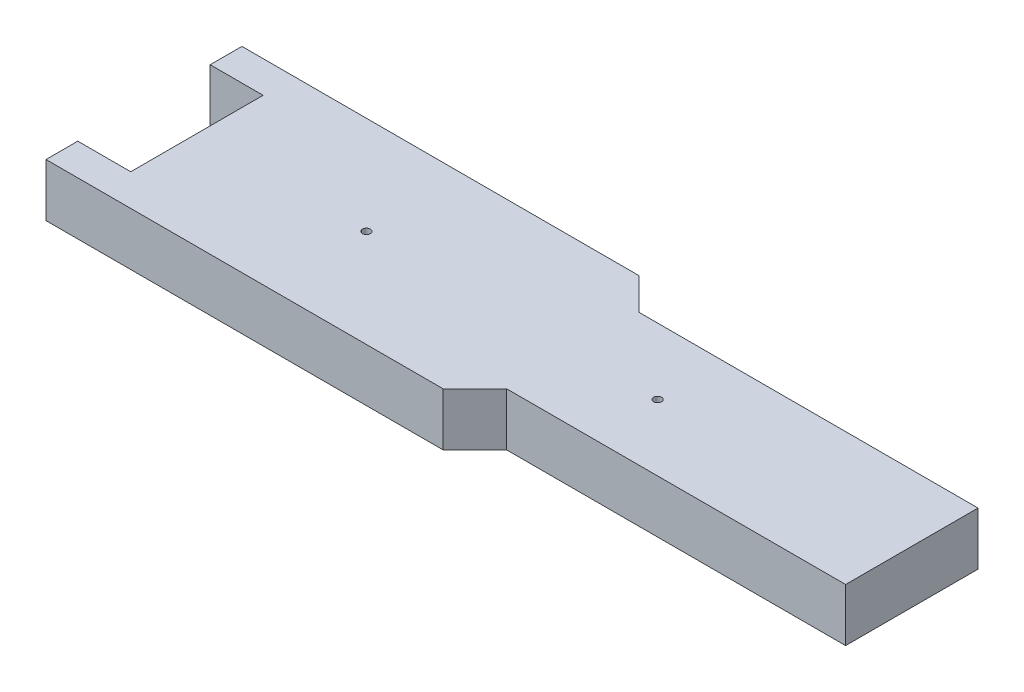
ISO-10303-21;
HEADER;
FILE_DESCRIPTION(('STEP AP214'),'2;1');
FILE_NAME('part.step','',(''),(''),'','','');
FILE_SCHEMA(('AUTOMOTIVE_DESIGN { 1 0 10303 214 1 1 1 1 }'));
ENDSEC;
DATA;
#1=APPLICATION_CONTEXT('core data for automotive mechanical design processes');
#2=APPLICATION_PROTOCOL_DEFINITION('international standard','automotive_design',2000,#1);
#3=PRODUCT_CONTEXT('',#1,'mechanical');
#4=PRODUCT('Part','Part','',(#3));
#5=PRODUCT_RELATED_PRODUCT_CATEGORY('part','',(#4));
#6=PRODUCT_DEFINITION_FORMATION('','',#4);
#7=PRODUCT_DEFINITION_CONTEXT('part definition',#1,'design');
#8=PRODUCT_DEFINITION('design','',#6,#7);
#9=PRODUCT_DEFINITION_SHAPE('','',#8);
#10=(LENGTH_UNIT() NAMED_UNIT(*) SI_UNIT(.MILLI.,.METRE.));
#11=(NAMED_UNIT(*) PLANE_ANGLE_UNIT() SI_UNIT($,.RADIAN.));
#12=(NAMED_UNIT(*) SI_UNIT($,.STERADIAN.) SOLID_ANGLE_UNIT());
#13=UNCERTAINTY_MEASURE_WITH_UNIT(LENGTH_MEASURE(1.E-05),#10,'distance_accuracy_value','');
#14=(GEOMETRIC_REPRESENTATION_CONTEXT(3) GLOBAL_UNCERTAINTY_ASSIGNED_CONTEXT((#13)) GLOBAL_UNIT_ASSIGNED_CONTEXT((#10,
#11,#12)) REPRESENTATION_CONTEXT('',''));
#15=CARTESIAN_POINT('',(0.,0.,0.));
#16=DIRECTION('',(0.,0.,1.));
#17=DIRECTION('',(1.,0.,0.));
#18=AXIS2_PLACEMENT_3D('',#15,#16,#17);
#19=CARTESIAN_POINT('',(0.,10.,-25.));
#20=DIRECTION('',(1.,0.,0.));
#21=DIRECTION('',(0.,0.,-1.));
#22=AXIS2_PLACEMENT_3D('',#19,#20,#21);
#23=PLANE('',#22);
#24=DIRECTION('',(0.,0.,1.));
#25=VECTOR('',#24,1.);
#26=CARTESIAN_POINT('',(0.,0.,-25.));
#27=LINE('',#26,#25);
#28=CARTESIAN_POINT('',(-1.11022302462516E-13,0.,-31.));
#29=VERTEX_POINT('',#28);
#30=CARTESIAN_POINT('',(0.,0.,-25.));
#31=VERTEX_POINT('',#30);
#32=EDGE_CURVE('E155',#29,#31,#27,.T.);
#33=ORIENTED_EDGE('',*,*,#32,.T.);
#34=DIRECTION('',(0.,-1.,0.));
#35=VECTOR('',#34,1.);
#36=CARTESIAN_POINT('',(0.,10.,-25.));
#37=LINE('',#36,#35);
#38=CARTESIAN_POINT('',(0.,10.,-25.));
#39=VERTEX_POINT('',#38);
#40=EDGE_CURVE('E11',#39,#31,#37,.T.);
#41=ORIENTED_EDGE('',*,*,#40,.F.);
#42=DIRECTION('',(0.,0.,1.));
#43=VECTOR('',#42,1.);
#44=CARTESIAN_POINT('',(0.,10.,-25.));
#45=LINE('',#44,#43);
#46=CARTESIAN_POINT('',(-1.11022302462516E-13,10.,-31.));
#47=VERTEX_POINT('',#46);
#48=EDGE_CURVE('E178',#47,#39,#45,.T.);
#49=ORIENTED_EDGE('',*,*,#48,.F.);
#50=DIRECTION('',(0.,-1.,0.));
#51=VECTOR('',#50,1.);
#52=CARTESIAN_POINT('',(-1.11022302462516E-13,10.,-31.));
#53=LINE('',#52,#51);
#54=EDGE_CURVE('E151',#47,#29,#53,.T.);
#55=ORIENTED_EDGE('',*,*,#54,.T.);
#56=EDGE_LOOP('',(#33,#41,#49,#55));
#57=FACE_BOUND('',#56,.T.);
#58=ADVANCED_FACE('F35',(#57),#23,.F.);
#59=CARTESIAN_POINT('',(9.99999999999998,10.,-25.));
#60=DIRECTION('',(0.,0.,-1.));
#61=DIRECTION('',(-1.,0.,0.));
#62=AXIS2_PLACEMENT_3D('',#59,#60,#61);
#63=PLANE('',#62);
#64=DIRECTION('',(1.,0.,0.));
#65=VECTOR('',#64,1.);
#66=CARTESIAN_POINT('',(9.99999999999998,0.,-25.));
#67=LINE('',#66,#65);
#68=CARTESIAN_POINT('',(9.99999999999998,0.,-25.));
#69=VERTEX_POINT('',#68);
#70=EDGE_CURVE('E158',#31,#69,#67,.T.);
#71=ORIENTED_EDGE('',*,*,#70,.T.);
#72=DIRECTION('',(0.,-1.,0.));
#73=VECTOR('',#72,1.);
#74=CARTESIAN_POINT('',(9.99999999999998,10.,-25.));
#75=LINE('',#74,#73);
#76=CARTESIAN_POINT('',(9.99999999999998,10.,-25.));
#77=VERTEX_POINT('',#76);
#78=EDGE_CURVE('E43',#77,#69,#75,.T.);
#79=ORIENTED_EDGE('',*,*,#78,.F.);
#80=DIRECTION('',(1.,0.,0.));
#81=VECTOR('',#80,1.);
#82=CARTESIAN_POINT('',(9.99999999999998,10.,-25.));
#83=LINE('',#82,#81);
#84=EDGE_CURVE('E106',#39,#77,#83,.T.);
#85=ORIENTED_EDGE('',*,*,#84,.F.);
#86=ORIENTED_EDGE('',*,*,#40,.T.);
#87=EDGE_LOOP('',(#71,#79,#85,#86));
#88=FACE_BOUND('',#87,.T.);
#89=ADVANCED_FACE('F257',(#88),#63,.F.);
#90=CARTESIAN_POINT('',(9.99999999999999,10.,0.));
#91=DIRECTION('',(1.,0.,0.));
#92=DIRECTION('',(0.,0.,-1.));
#93=AXIS2_PLACEMENT_3D('',#90,#91,#92);
#94=PLANE('',#93);
#95=DIRECTION('',(0.,0.,1.));
#96=VECTOR('',#95,1.);
#97=CARTESIAN_POINT('',(9.99999999999999,0.,0.));
#98=LINE('',#97,#96);
#99=CARTESIAN_POINT('',(9.99999999999999,0.,0.));
#100=VERTEX_POINT('',#99);
#101=EDGE_CURVE('E161',#69,#100,#98,.T.);
#102=ORIENTED_EDGE('',*,*,#101,.T.);
#103=DIRECTION('',(0.,-1.,0.));
#104=VECTOR('',#103,1.);
#105=CARTESIAN_POINT('',(9.99999999999999,10.,0.));
#106=LINE('',#105,#104);
#107=CARTESIAN_POINT('',(9.99999999999999,10.,0.));
#108=VERTEX_POINT('',#107);
#109=EDGE_CURVE('E197',#108,#100,#106,.T.);
#110=ORIENTED_EDGE('',*,*,#109,.F.);
#111=DIRECTION('',(0.,0.,1.));
#112=VECTOR('',#111,1.);
#113=CARTESIAN_POINT('',(9.99999999999999,10.,0.));
#114=LINE('',#113,#112);
#115=EDGE_CURVE('E205',#77,#108,#114,.T.);
#116=ORIENTED_EDGE('',*,*,#115,.F.);
#117=ORIENTED_EDGE('',*,*,#78,.T.);
#118=EDGE_LOOP('',(#102,#110,#116,#117));
#119=FACE_BOUND('',#118,.T.);
#120=ADVANCED_FACE('F203',(#119),#94,.F.);
#121=CARTESIAN_POINT('',(0.,10.,0.));
#122=DIRECTION('',(0.,0.,1.));
#123=DIRECTION('',(1.,0.,0.));
#124=AXIS2_PLACEMENT_3D('',#121,#122,#123);
#125=PLANE('',#124);
#126=DIRECTION('',(-1.,0.,0.));
#127=VECTOR('',#126,1.);
#128=CARTESIAN_POINT('',(0.,0.,0.));
#129=LINE('',#128,#127);
#130=CARTESIAN_POINT('',(0.,0.,0.));
#131=VERTEX_POINT('',#130);
#132=EDGE_CURVE('E163',#100,#131,#129,.T.);
#133=ORIENTED_EDGE('',*,*,#132,.T.);
#134=DIRECTION('',(0.,-1.,0.));
#135=VECTOR('',#134,1.);
#136=CARTESIAN_POINT('',(0.,10.,0.));
#137=LINE('',#136,#135);
#138=CARTESIAN_POINT('',(0.,10.,0.));
#139=VERTEX_POINT('',#138);
#140=EDGE_CURVE('E194',#139,#131,#137,.T.);
#141=ORIENTED_EDGE('',*,*,#140,.F.);
#142=DIRECTION('',(-1.,0.,0.));
#143=VECTOR('',#142,1.);
#144=CARTESIAN_POINT('',(0.,10.,0.));
#145=LINE('',#144,#143);
#146=EDGE_CURVE('E223',#108,#139,#145,.T.);
#147=ORIENTED_EDGE('',*,*,#146,.F.);
#148=ORIENTED_EDGE('',*,*,#109,.T.);
#149=EDGE_LOOP('',(#133,#141,#147,#148));
#150=FACE_BOUND('',#149,.T.);
#151=ADVANCED_FACE('F214',(#150),#125,.F.);
#152=CARTESIAN_POINT('',(0.,10.,6.00000000000009));
#153=DIRECTION('',(1.,0.,0.));
#154=DIRECTION('',(0.,0.,-1.));
#155=AXIS2_PLACEMENT_3D('',#152,#153,#154);
#156=PLANE('',#155);
#157=DIRECTION('',(0.,0.,1.));
#158=VECTOR('',#157,1.);
#159=CARTESIAN_POINT('',(0.,0.,6.00000000000009));
#160=LINE('',#159,#158);
#161=CARTESIAN_POINT('',(0.,0.,6.00000000000009));
#162=VERTEX_POINT('',#161);
#163=EDGE_CURVE('E165',#131,#162,#160,.T.);
#164=ORIENTED_EDGE('',*,*,#163,.T.);
#165=DIRECTION('',(0.,-1.,0.));
#166=VECTOR('',#165,1.);
#167=CARTESIAN_POINT('',(0.,10.,6.00000000000009));
#168=LINE('',#167,#166);
#169=CARTESIAN_POINT('',(0.,10.,6.00000000000009));
#170=VERTEX_POINT('',#169);
#171=EDGE_CURVE('E191',#170,#162,#168,.T.);
#172=ORIENTED_EDGE('',*,*,#171,.F.);
#173=DIRECTION('',(0.,0.,1.));
#174=VECTOR('',#173,1.);
#175=CARTESIAN_POINT('',(0.,10.,6.00000000000009));
#176=LINE('',#175,#174);
#177=EDGE_CURVE('E220',#139,#170,#176,.T.);
#178=ORIENTED_EDGE('',*,*,#177,.F.);
#179=ORIENTED_EDGE('',*,*,#140,.T.);
#180=EDGE_LOOP('',(#164,#172,#178,#179));
#181=FACE_BOUND('',#180,.T.);
#182=ADVANCED_FACE('F218',(#181),#156,.F.);
#183=CARTESIAN_POINT('',(75.,10.,6.00000000000002));
#184=DIRECTION('',(0.,0.,-1.));
#185=DIRECTION('',(-1.,0.,0.));
#186=AXIS2_PLACEMENT_3D('',#183,#184,#185);
#187=PLANE('',#186);
#188=DIRECTION('',(1.,0.,0.));
#189=VECTOR('',#188,1.);
#190=CARTESIAN_POINT('',(75.,0.,6.00000000000002));
#191=LINE('',#190,#189);
#192=CARTESIAN_POINT('',(75.,0.,6.00000000000002));
#193=VERTEX_POINT('',#192);
#194=EDGE_CURVE('E167',#162,#193,#191,.T.);
#195=ORIENTED_EDGE('',*,*,#194,.T.);
#196=DIRECTION('',(0.,-1.,0.));
#197=VECTOR('',#196,1.);
#198=CARTESIAN_POINT('',(75.,10.,6.00000000000002));
#199=LINE('',#198,#197);
#200=CARTESIAN_POINT('',(75.,10.,6.00000000000002));
#201=VERTEX_POINT('',#200);
#202=EDGE_CURVE('E188',#201,#193,#199,.T.);
#203=ORIENTED_EDGE('',*,*,#202,.F.);
#204=DIRECTION('',(1.,0.,0.));
#205=VECTOR('',#204,1.);
#206=CARTESIAN_POINT('',(75.,10.,6.00000000000002));
#207=LINE('',#206,#205);
#208=EDGE_CURVE('E222',#170,#201,#207,.T.);
#209=ORIENTED_EDGE('',*,*,#208,.F.);
#210=ORIENTED_EDGE('',*,*,#171,.T.);
#211=EDGE_LOOP('',(#195,#203,#209,#210));
#212=FACE_BOUND('',#211,.T.);
#213=ADVANCED_FACE('F270',(#212),#187,.F.);
#214=CARTESIAN_POINT('',(80.9999999999998,10.,0.));
#215=DIRECTION('',(-0.707106781186556,0.,-0.70710678118654));
#216=DIRECTION('',(-0.70710678118654,0.,0.707106781186556));
#217=AXIS2_PLACEMENT_3D('',#214,#215,#216);
#218=PLANE('',#217);
#219=DIRECTION('',(0.70710678118654,0.,-0.707106781186556));
#220=VECTOR('',#219,1.);
#221=CARTESIAN_POINT('',(80.9999999999998,0.,0.));
#222=LINE('',#221,#220);
#223=CARTESIAN_POINT('',(80.9999999999998,0.,0.));
#224=VERTEX_POINT('',#223);
#225=EDGE_CURVE('E169',#193,#224,#222,.T.);
#226=ORIENTED_EDGE('',*,*,#225,.T.);
#227=DIRECTION('',(0.,-1.,0.));
#228=VECTOR('',#227,1.);
#229=CARTESIAN_POINT('',(80.9999999999998,10.,0.));
#230=LINE('',#229,#228);
#231=CARTESIAN_POINT('',(80.9999999999998,10.,0.));
#232=VERTEX_POINT('',#231);
#233=EDGE_CURVE('E185',#232,#224,#230,.T.);
#234=ORIENTED_EDGE('',*,*,#233,.F.);
#235=DIRECTION('',(0.70710678118654,0.,-0.707106781186556));
#236=VECTOR('',#235,1.);
#237=CARTESIAN_POINT('',(80.9999999999998,10.,0.));
#238=LINE('',#237,#236);
#239=EDGE_CURVE('E225',#201,#232,#238,.T.);
#240=ORIENTED_EDGE('',*,*,#239,.F.);
#241=ORIENTED_EDGE('',*,*,#202,.T.);
#242=EDGE_LOOP('',(#226,#234,#240,#241));
#243=FACE_BOUND('',#242,.T.);
#244=ADVANCED_FACE('F273',(#243),#218,.F.);
#245=CARTESIAN_POINT('',(145.,10.,0.));
#246=DIRECTION('',(0.,0.,-1.));
#247=DIRECTION('',(-1.,0.,0.));
#248=AXIS2_PLACEMENT_3D('',#245,#246,#247);
#249=PLANE('',#248);
#250=DIRECTION('',(1.,0.,0.));
#251=VECTOR('',#250,1.);
#252=CARTESIAN_POINT('',(145.,0.,0.));
#253=LINE('',#252,#251);
#254=CARTESIAN_POINT('',(145.,0.,0.));
#255=VERTEX_POINT('',#254);
#256=EDGE_CURVE('E171',#224,#255,#253,.T.);
#257=ORIENTED_EDGE('',*,*,#256,.T.);
#258=DIRECTION('',(0.,-1.,0.));
#259=VECTOR('',#258,1.);
#260=CARTESIAN_POINT('',(145.,10.,0.));
#261=LINE('',#260,#259);
#262=CARTESIAN_POINT('',(145.,10.,0.));
#263=VERTEX_POINT('',#262);
#264=EDGE_CURVE('E182',#263,#255,#261,.T.);
#265=ORIENTED_EDGE('',*,*,#264,.F.);
#266=DIRECTION('',(1.,0.,0.));
#267=VECTOR('',#266,1.);
#268=CARTESIAN_POINT('',(145.,10.,0.));
#269=LINE('',#268,#267);
#270=EDGE_CURVE('E231',#232,#263,#269,.T.);
#271=ORIENTED_EDGE('',*,*,#270,.F.);
#272=ORIENTED_EDGE('',*,*,#233,.T.);
#273=EDGE_LOOP('',(#257,#265,#271,#272));
#274=FACE_BOUND('',#273,.T.);
#275=ADVANCED_FACE('F237',(#274),#249,.F.);
#276=CARTESIAN_POINT('',(145.,10.,-25.0000000000001));
#277=DIRECTION('',(-1.,0.,0.));
#278=DIRECTION('',(0.,0.,1.));
#279=AXIS2_PLACEMENT_3D('',#276,#277,#278);
#280=PLANE('',#279);
#281=DIRECTION('',(0.,0.,-1.));
#282=VECTOR('',#281,1.);
#283=CARTESIAN_POINT('',(145.,0.,-25.0000000000001));
#284=LINE('',#283,#282);
#285=CARTESIAN_POINT('',(145.,0.,-25.0000000000001));
#286=VERTEX_POINT('',#285);
#287=EDGE_CURVE('E173',#255,#286,#284,.T.);
#288=ORIENTED_EDGE('',*,*,#287,.T.);
#289=DIRECTION('',(0.,-1.,0.));
#290=VECTOR('',#289,1.);
#291=CARTESIAN_POINT('',(145.,10.,-25.0000000000001));
#292=LINE('',#291,#290);
#293=CARTESIAN_POINT('',(145.,10.,-25.0000000000001));
#294=VERTEX_POINT('',#293);
#295=EDGE_CURVE('E146',#294,#286,#292,.T.);
#296=ORIENTED_EDGE('',*,*,#295,.F.);
#297=DIRECTION('',(0.,0.,-1.));
#298=VECTOR('',#297,1.);
#299=CARTESIAN_POINT('',(145.,10.,-25.0000000000001));
#300=LINE('',#299,#298);
#301=EDGE_CURVE('E137',#263,#294,#300,.T.);
#302=ORIENTED_EDGE('',*,*,#301,.F.);
#303=ORIENTED_EDGE('',*,*,#264,.T.);
#304=EDGE_LOOP('',(#288,#296,#302,#303));
#305=FACE_BOUND('',#304,.T.);
#306=ADVANCED_FACE('F241',(#305),#280,.F.);
#307=CARTESIAN_POINT('',(80.9999999999999,10.,-25.0000000000001));
#308=DIRECTION('',(0.,0.,1.));
#309=DIRECTION('',(1.,0.,0.));
#310=AXIS2_PLACEMENT_3D('',#307,#308,#309);
#311=PLANE('',#310);
#312=DIRECTION('',(-1.,0.,0.));
#313=VECTOR('',#312,1.);
#314=CARTESIAN_POINT('',(80.9999999999999,0.,-25.0000000000001));
#315=LINE('',#314,#313);
#316=CARTESIAN_POINT('',(80.9999999999999,0.,-25.0000000000001));
#317=VERTEX_POINT('',#316);
#318=EDGE_CURVE('E145',#286,#317,#315,.T.);
#319=ORIENTED_EDGE('',*,*,#318,.T.);
#320=DIRECTION('',(0.,-1.,0.));
#321=VECTOR('',#320,1.);
#322=CARTESIAN_POINT('',(80.9999999999999,10.,-25.0000000000001));
#323=LINE('',#322,#321);
#324=CARTESIAN_POINT('',(80.9999999999999,10.,-25.0000000000001));
#325=VERTEX_POINT('',#324);
#326=EDGE_CURVE('E142',#325,#317,#323,.T.);
#327=ORIENTED_EDGE('',*,*,#326,.F.);
#328=DIRECTION('',(-1.,0.,0.));
#329=VECTOR('',#328,1.);
#330=CARTESIAN_POINT('',(80.9999999999999,10.,-25.0000000000001));
#331=LINE('',#330,#329);
#332=EDGE_CURVE('E131',#294,#325,#331,.T.);
#333=ORIENTED_EDGE('',*,*,#332,.F.);
#334=ORIENTED_EDGE('',*,*,#295,.T.);
#335=EDGE_LOOP('',(#319,#327,#333,#334));
#336=FACE_BOUND('',#335,.T.);
#337=ADVANCED_FACE('F143',(#336),#311,.F.);
#338=CARTESIAN_POINT('',(74.9999999999999,10.,-30.9999999999999));
#339=DIRECTION('',(-0.707106781186541,0.,0.707106781186554));
#340=DIRECTION('',(0.707106781186554,0.,0.707106781186541));
#341=AXIS2_PLACEMENT_3D('',#338,#339,#340);
#342=PLANE('',#341);
#343=DIRECTION('',(-0.707106781186554,0.,-0.707106781186541));
#344=VECTOR('',#343,1.);
#345=CARTESIAN_POINT('',(74.9999999999999,0.,-30.9999999999999));
#346=LINE('',#345,#344);
#347=CARTESIAN_POINT('',(74.9999999999999,0.,-30.9999999999999));
#348=VERTEX_POINT('',#347);
#349=EDGE_CURVE('E92',#317,#348,#346,.T.);
#350=ORIENTED_EDGE('',*,*,#349,.T.);
#351=DIRECTION('',(0.,-1.,0.));
#352=VECTOR('',#351,1.);
#353=CARTESIAN_POINT('',(74.9999999999999,10.,-30.9999999999999));
#354=LINE('',#353,#352);
#355=CARTESIAN_POINT('',(74.9999999999999,10.,-30.9999999999999));
#356=VERTEX_POINT('',#355);
#357=EDGE_CURVE('E147',#356,#348,#354,.T.);
#358=ORIENTED_EDGE('',*,*,#357,.F.);
#359=DIRECTION('',(-0.707106781186554,0.,-0.707106781186541));
#360=VECTOR('',#359,1.);
#361=CARTESIAN_POINT('',(74.9999999999999,10.,-30.9999999999999));
#362=LINE('',#361,#360);
#363=EDGE_CURVE('E135',#325,#356,#362,.T.);
#364=ORIENTED_EDGE('',*,*,#363,.F.);
#365=ORIENTED_EDGE('',*,*,#326,.T.);
#366=EDGE_LOOP('',(#350,#358,#364,#365));
#367=FACE_BOUND('',#366,.T.);
#368=ADVANCED_FACE('F149',(#367),#342,.F.);
#369=CARTESIAN_POINT('',(-1.11022302462516E-13,10.,-31.));
#370=DIRECTION('',(0.,0.,1.));
#371=DIRECTION('',(1.,0.,0.));
#372=AXIS2_PLACEMENT_3D('',#369,#370,#371);
#373=PLANE('',#372);
#374=DIRECTION('',(-1.,0.,0.));
#375=VECTOR('',#374,1.);
#376=CARTESIAN_POINT('',(-1.11022302462516E-13,0.,-31.));
#377=LINE('',#376,#375);
#378=EDGE_CURVE('E98',#348,#29,#377,.T.);
#379=ORIENTED_EDGE('',*,*,#378,.T.);
#380=ORIENTED_EDGE('',*,*,#54,.F.);
#381=DIRECTION('',(-1.,0.,0.));
#382=VECTOR('',#381,1.);
#383=CARTESIAN_POINT('',(-1.11022302462516E-13,10.,-31.));
#384=LINE('',#383,#382);
#385=EDGE_CURVE('E51',#356,#47,#384,.T.);
#386=ORIENTED_EDGE('',*,*,#385,.F.);
#387=ORIENTED_EDGE('',*,*,#357,.T.);
#388=EDGE_LOOP('',(#379,#380,#386,#387));
#389=FACE_BOUND('',#388,.T.);
#390=ADVANCED_FACE('F245',(#389),#373,.F.);
#391=CARTESIAN_POINT('',(0.,10.,0.));
#392=DIRECTION('',(0.,-1.,0.));
#393=DIRECTION('',(0.,0.,-1.));
#394=AXIS2_PLACEMENT_3D('',#391,#392,#393);
#395=PLANE('',#394);
#396=CARTESIAN_POINT('',(96.9999999999999,10.,-12.5));
#397=DIRECTION('',(0.,1.,0.));
#398=DIRECTION('',(0.,0.,1.));
#399=AXIS2_PLACEMENT_3D('',#396,#397,#398);
#400=CIRCLE('',#399,0.749999999999999);
#401=CARTESIAN_POINT('',(96.9999999999999,10.,-11.75));
#402=VERTEX_POINT('',#401);
#403=EDGE_CURVE('E339',#402,#402,#400,.T.);
#404=ORIENTED_EDGE('',*,*,#403,.F.);
#405=EDGE_LOOP('',(#404));
#406=FACE_BOUND('',#405,.T.);
#407=CARTESIAN_POINT('',(41.9999999999999,10.,-12.4999999999999));
#408=DIRECTION('',(0.,1.,0.));
#409=DIRECTION('',(0.,0.,1.));
#410=AXIS2_PLACEMENT_3D('',#407,#408,#409);
#411=CIRCLE('',#410,0.749999999999999);
#412=CARTESIAN_POINT('',(41.9999999999999,10.,-11.75));
#413=VERTEX_POINT('',#412);
#414=EDGE_CURVE('E341',#413,#413,#411,.T.);
#415=ORIENTED_EDGE('',*,*,#414,.F.);
#416=EDGE_LOOP('',(#415));
#417=FACE_BOUND('',#416,.T.);
#418=ORIENTED_EDGE('',*,*,#48,.T.);
#419=ORIENTED_EDGE('',*,*,#84,.T.);
#420=ORIENTED_EDGE('',*,*,#115,.T.);
#421=ORIENTED_EDGE('',*,*,#146,.T.);
#422=ORIENTED_EDGE('',*,*,#177,.T.);
#423=ORIENTED_EDGE('',*,*,#208,.T.);
#424=ORIENTED_EDGE('',*,*,#239,.T.);
#425=ORIENTED_EDGE('',*,*,#270,.T.);
#426=ORIENTED_EDGE('',*,*,#301,.T.);
#427=ORIENTED_EDGE('',*,*,#332,.T.);
#428=ORIENTED_EDGE('',*,*,#363,.T.);
#429=ORIENTED_EDGE('',*,*,#385,.T.);
#430=EDGE_LOOP('',(#418,#419,#420,#421,#422,#423,#424,#425,#426,#427,#428,#429));
#431=FACE_BOUND('',#430,.T.);
#432=ADVANCED_FACE('F133',(#406,#417,#431),#395,.F.);
#433=CARTESIAN_POINT('',(0.,0.,0.));
#434=DIRECTION('',(0.,-1.,0.));
#435=DIRECTION('',(0.,0.,-1.));
#436=AXIS2_PLACEMENT_3D('',#433,#434,#435);
#437=PLANE('',#436);
#438=CARTESIAN_POINT('',(96.9999999999999,0.,-12.5));
#439=DIRECTION('',(0.,1.,0.));
#440=DIRECTION('',(0.,0.,1.));
#441=AXIS2_PLACEMENT_3D('',#438,#439,#440);
#442=CIRCLE('',#441,0.749999999999999);
#443=CARTESIAN_POINT('',(96.9999999999999,0.,-11.75));
#444=VERTEX_POINT('',#443);
#445=EDGE_CURVE('E336',#444,#444,#442,.T.);
#446=ORIENTED_EDGE('',*,*,#445,.T.);
#447=EDGE_LOOP('',(#446));
#448=FACE_BOUND('',#447,.T.);
#449=CARTESIAN_POINT('',(41.9999999999999,0.,-12.4999999999999));
#450=DIRECTION('',(0.,1.,0.));
#451=DIRECTION('',(0.,0.,1.));
#452=AXIS2_PLACEMENT_3D('',#449,#450,#451);
#453=CIRCLE('',#452,0.749999999999999);
#454=CARTESIAN_POINT('',(41.9999999999999,0.,-11.75));
#455=VERTEX_POINT('',#454);
#456=EDGE_CURVE('E159',#455,#455,#453,.T.);
#457=ORIENTED_EDGE('',*,*,#456,.T.);
#458=EDGE_LOOP('',(#457));
#459=FACE_BOUND('',#458,.T.);
#460=ORIENTED_EDGE('',*,*,#32,.F.);
#461=ORIENTED_EDGE('',*,*,#378,.F.);
#462=ORIENTED_EDGE('',*,*,#349,.F.);
#463=ORIENTED_EDGE('',*,*,#318,.F.);
#464=ORIENTED_EDGE('',*,*,#287,.F.);
#465=ORIENTED_EDGE('',*,*,#256,.F.);
#466=ORIENTED_EDGE('',*,*,#225,.F.);
#467=ORIENTED_EDGE('',*,*,#194,.F.);
#468=ORIENTED_EDGE('',*,*,#163,.F.);
#469=ORIENTED_EDGE('',*,*,#132,.F.);
#470=ORIENTED_EDGE('',*,*,#101,.F.);
#471=ORIENTED_EDGE('',*,*,#70,.F.);
#472=EDGE_LOOP('',(#460,#461,#462,#463,#464,#465,#466,#467,#468,#469,#470,#471));
#473=FACE_BOUND('',#472,.T.);
#474=ADVANCED_FACE('F209',(#448,#459,#473),#437,.T.);
#475=CARTESIAN_POINT('',(41.9999999999999,0.,-12.4999999999999));
#476=DIRECTION('',(0.,1.,0.));
#477=DIRECTION('',(0.,0.,1.));
#478=AXIS2_PLACEMENT_3D('',#475,#476,#477);
#479=CYLINDRICAL_SURFACE('',#478,0.749999999999999);
#480=ORIENTED_EDGE('',*,*,#456,.F.);
#481=EDGE_LOOP('',(#480));
#482=FACE_BOUND('',#481,.T.);
#483=ORIENTED_EDGE('',*,*,#414,.T.);
#484=EDGE_LOOP('',(#483));
#485=FACE_BOUND('',#484,.T.);
#486=ADVANCED_FACE('F301',(#482,#485),#479,.F.);
#487=CARTESIAN_POINT('',(96.9999999999999,0.,-12.5));
#488=DIRECTION('',(0.,1.,0.));
#489=DIRECTION('',(0.,0.,1.));
#490=AXIS2_PLACEMENT_3D('',#487,#488,#489);
#491=CYLINDRICAL_SURFACE('',#490,0.749999999999999);
#492=ORIENTED_EDGE('',*,*,#445,.F.);
#493=EDGE_LOOP('',(#492));
#494=FACE_BOUND('',#493,.T.);
#495=ORIENTED_EDGE('',*,*,#403,.T.);
#496=EDGE_LOOP('',(#495));
#497=FACE_BOUND('',#496,.T.);
#498=ADVANCED_FACE('F306',(#494,#497),#491,.F.);
#499=CLOSED_SHELL('',(#58,#89,#120,#151,#182,#213,#244,#275,#306,#337,#368,#390,#432,#474,#486,#498));
#500=MANIFOLD_SOLID_BREP('B2',#499);
#501=ADVANCED_BREP_SHAPE_REPRESENTATION('',(#18,#500),#14);
#502=SHAPE_DEFINITION_REPRESENTATION(#9,#501);
ENDSEC;
END-ISO-10303-21;
